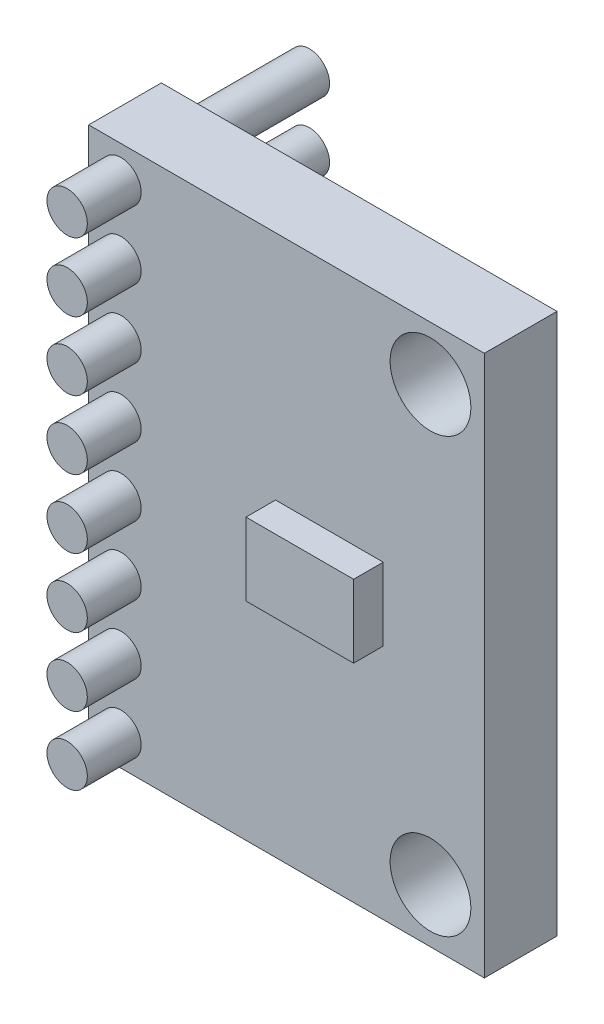
ISO-10303-21;
HEADER;
FILE_DESCRIPTION(('STEP AP214'),'2;1');
FILE_NAME('part.step','',(''),(''),'','','');
FILE_SCHEMA(('AUTOMOTIVE_DESIGN { 1 0 10303 214 1 1 1 1 }'));
ENDSEC;
DATA;
#1=APPLICATION_CONTEXT('core data for automotive mechanical design processes');
#2=APPLICATION_PROTOCOL_DEFINITION('international standard','automotive_design',2000,#1);
#3=PRODUCT_CONTEXT('',#1,'mechanical');
#4=PRODUCT('Part','Part','',(#3));
#5=PRODUCT_RELATED_PRODUCT_CATEGORY('part','',(#4));
#6=PRODUCT_DEFINITION_FORMATION('','',#4);
#7=PRODUCT_DEFINITION_CONTEXT('part definition',#1,'design');
#8=PRODUCT_DEFINITION('design','',#6,#7);
#9=PRODUCT_DEFINITION_SHAPE('','',#8);
#10=(LENGTH_UNIT() NAMED_UNIT(*) SI_UNIT(.MILLI.,.METRE.));
#11=(NAMED_UNIT(*) PLANE_ANGLE_UNIT() SI_UNIT($,.RADIAN.));
#12=(NAMED_UNIT(*) SI_UNIT($,.STERADIAN.) SOLID_ANGLE_UNIT());
#13=UNCERTAINTY_MEASURE_WITH_UNIT(LENGTH_MEASURE(1.E-05),#10,'distance_accuracy_value','');
#14=(GEOMETRIC_REPRESENTATION_CONTEXT(3) GLOBAL_UNCERTAINTY_ASSIGNED_CONTEXT((#13)) GLOBAL_UNIT_ASSIGNED_CONTEXT((#10,
#11,#12)) REPRESENTATION_CONTEXT('',''));
#15=CARTESIAN_POINT('',(0.,0.,0.));
#16=DIRECTION('',(0.,0.,1.));
#17=DIRECTION('',(1.,0.,0.));
#18=AXIS2_PLACEMENT_3D('',#15,#16,#17);
#19=CARTESIAN_POINT('',(-0.0249547085544615,-7.62988142191552,9.01269904910709));
#20=DIRECTION('',(-4.37113882867379E-08,0.,0.999999999999999));
#21=DIRECTION('',(0.999999999999999,0.,4.37113882867379E-08));
#22=AXIS2_PLACEMENT_3D('',#19,#20,#21);
#23=PLANE('',#22);
#24=CARTESIAN_POINT('',(-0.0249547085544615,-7.62988142191552,9.01269904910709));
#25=DIRECTION('',(-4.37113882867379E-08,0.,0.999999999999999));
#26=DIRECTION('',(0.999999999999999,0.,4.37113882867379E-08));
#27=AXIS2_PLACEMENT_3D('',#24,#25,#26);
#28=CIRCLE('',#27,0.750000000000001);
#29=CARTESIAN_POINT('',(0.725045291445539,-7.62988142191552,9.01269908189063));
#30=VERTEX_POINT('',#29);
#31=EDGE_CURVE('E280',#30,#30,#28,.F.);
#32=ORIENTED_EDGE('',*,*,#31,.F.);
#33=EDGE_LOOP('',(#32));
#34=FACE_BOUND('',#33,.T.);
#35=ADVANCED_FACE('F17',(#34),#23,.T.);
#36=CARTESIAN_POINT('',(-0.0249549003191127,-5.08988142191552,9.01269904910709));
#37=DIRECTION('',(-4.37113882867379E-08,0.,0.999999999999999));
#38=DIRECTION('',(0.999999999999999,0.,4.37113882867379E-08));
#39=AXIS2_PLACEMENT_3D('',#36,#37,#38);
#40=PLANE('',#39);
#41=CARTESIAN_POINT('',(-0.0249549003191128,-5.08988142191552,9.01269904910709));
#42=DIRECTION('',(-4.37113882867379E-08,0.,0.999999999999999));
#43=DIRECTION('',(0.999999999999999,0.,4.37113882867379E-08));
#44=AXIS2_PLACEMENT_3D('',#41,#42,#43);
#45=CIRCLE('',#44,0.750000000000001);
#46=CARTESIAN_POINT('',(0.725045099680888,-5.08988142191552,9.01269908189063));
#47=VERTEX_POINT('',#46);
#48=EDGE_CURVE('E275',#47,#47,#45,.F.);
#49=ORIENTED_EDGE('',*,*,#48,.F.);
#50=EDGE_LOOP('',(#49));
#51=FACE_BOUND('',#50,.T.);
#52=ADVANCED_FACE('F288',(#51),#40,.T.);
#53=CARTESIAN_POINT('',(-0.0249550920837631,-2.54988142191552,9.01269904910709));
#54=DIRECTION('',(-4.37113882867379E-08,0.,0.999999999999999));
#55=DIRECTION('',(0.999999999999999,0.,4.37113882867379E-08));
#56=AXIS2_PLACEMENT_3D('',#53,#54,#55);
#57=PLANE('',#56);
#58=CARTESIAN_POINT('',(-0.0249550920837631,-2.54988142191552,9.01269904910709));
#59=DIRECTION('',(-4.37113882867379E-08,0.,0.999999999999999));
#60=DIRECTION('',(0.999999999999999,0.,4.37113882867379E-08));
#61=AXIS2_PLACEMENT_3D('',#58,#59,#60);
#62=CIRCLE('',#61,0.750000000000001);
#63=CARTESIAN_POINT('',(0.725044907916237,-2.54988142191552,9.01269908189063));
#64=VERTEX_POINT('',#63);
#65=EDGE_CURVE('E270',#64,#64,#62,.F.);
#66=ORIENTED_EDGE('',*,*,#65,.F.);
#67=EDGE_LOOP('',(#66));
#68=FACE_BOUND('',#67,.T.);
#69=ADVANCED_FACE('F293',(#68),#57,.T.);
#70=CARTESIAN_POINT('',(-0.0249552838484144,-0.00988142191551966,9.01269904910709));
#71=DIRECTION('',(-4.37113882867379E-08,0.,0.999999999999999));
#72=DIRECTION('',(0.999999999999999,0.,4.37113882867379E-08));
#73=AXIS2_PLACEMENT_3D('',#70,#71,#72);
#74=PLANE('',#73);
#75=CARTESIAN_POINT('',(-0.0249552838484144,-0.00988142191551961,9.01269904910709));
#76=DIRECTION('',(-4.37113882867379E-08,0.,0.999999999999999));
#77=DIRECTION('',(0.999999999999999,0.,4.37113882867379E-08));
#78=AXIS2_PLACEMENT_3D('',#75,#76,#77);
#79=CIRCLE('',#78,0.75);
#80=CARTESIAN_POINT('',(0.725044716151585,-0.00988142191551961,9.01269908189063));
#81=VERTEX_POINT('',#80);
#82=EDGE_CURVE('E265',#81,#81,#79,.F.);
#83=ORIENTED_EDGE('',*,*,#82,.F.);
#84=EDGE_LOOP('',(#83));
#85=FACE_BOUND('',#84,.T.);
#86=ADVANCED_FACE('F455',(#85),#74,.T.);
#87=CARTESIAN_POINT('',(-0.0249554756130657,2.53011857808448,9.01269904910709));
#88=DIRECTION('',(-4.37113882867379E-08,0.,0.999999999999999));
#89=DIRECTION('',(0.999999999999999,0.,4.37113882867379E-08));
#90=AXIS2_PLACEMENT_3D('',#87,#88,#89);
#91=PLANE('',#90);
#92=CARTESIAN_POINT('',(-0.0249554756130657,2.53011857808448,9.01269904910709));
#93=DIRECTION('',(-4.37113882867379E-08,0.,0.999999999999999));
#94=DIRECTION('',(0.999999999999999,0.,4.37113882867379E-08));
#95=AXIS2_PLACEMENT_3D('',#92,#93,#94);
#96=CIRCLE('',#95,0.75);
#97=CARTESIAN_POINT('',(0.725044524386934,2.53011857808448,9.01269908189063));
#98=VERTEX_POINT('',#97);
#99=EDGE_CURVE('E260',#98,#98,#96,.F.);
#100=ORIENTED_EDGE('',*,*,#99,.F.);
#101=EDGE_LOOP('',(#100));
#102=FACE_BOUND('',#101,.T.);
#103=ADVANCED_FACE('F451',(#102),#91,.T.);
#104=CARTESIAN_POINT('',(-0.0249556673777169,5.07011857808448,9.01269904910709));
#105=DIRECTION('',(-4.37113882867379E-08,0.,0.999999999999999));
#106=DIRECTION('',(0.999999999999999,0.,4.37113882867379E-08));
#107=AXIS2_PLACEMENT_3D('',#104,#105,#106);
#108=PLANE('',#107);
#109=CARTESIAN_POINT('',(-0.0249556673777169,5.07011857808448,9.01269904910709));
#110=DIRECTION('',(-4.37113882867379E-08,0.,0.999999999999999));
#111=DIRECTION('',(0.999999999999999,0.,4.37113882867379E-08));
#112=AXIS2_PLACEMENT_3D('',#109,#110,#111);
#113=CIRCLE('',#112,0.75);
#114=CARTESIAN_POINT('',(0.725044332622282,5.07011857808448,9.01269908189063));
#115=VERTEX_POINT('',#114);
#116=EDGE_CURVE('E255',#115,#115,#113,.F.);
#117=ORIENTED_EDGE('',*,*,#116,.F.);
#118=EDGE_LOOP('',(#117));
#119=FACE_BOUND('',#118,.T.);
#120=ADVANCED_FACE('F447',(#119),#108,.T.);
#121=CARTESIAN_POINT('',(-0.0249558591423682,7.61011857808448,9.01269904910709));
#122=DIRECTION('',(-4.37113882867379E-08,0.,0.999999999999999));
#123=DIRECTION('',(0.999999999999999,0.,4.37113882867379E-08));
#124=AXIS2_PLACEMENT_3D('',#121,#122,#123);
#125=PLANE('',#124);
#126=CARTESIAN_POINT('',(-0.0249558591423682,7.61011857808448,9.01269904910709));
#127=DIRECTION('',(-4.37113882867379E-08,0.,0.999999999999999));
#128=DIRECTION('',(0.999999999999999,0.,4.37113882867379E-08));
#129=AXIS2_PLACEMENT_3D('',#126,#127,#128);
#130=CIRCLE('',#129,0.750000000000001);
#131=CARTESIAN_POINT('',(0.725044140857632,7.61011857808448,9.01269908189063));
#132=VERTEX_POINT('',#131);
#133=EDGE_CURVE('E250',#132,#132,#130,.F.);
#134=ORIENTED_EDGE('',*,*,#133,.F.);
#135=EDGE_LOOP('',(#134));
#136=FACE_BOUND('',#135,.T.);
#137=ADVANCED_FACE('F443',(#136),#125,.T.);
#138=CARTESIAN_POINT('',(-0.0249560509070195,10.1501185780845,9.01269904910709));
#139=DIRECTION('',(-4.37113882867379E-08,0.,0.999999999999999));
#140=DIRECTION('',(0.999999999999999,0.,4.37113882867379E-08));
#141=AXIS2_PLACEMENT_3D('',#138,#139,#140);
#142=PLANE('',#141);
#143=CARTESIAN_POINT('',(-0.0249560509070195,10.1501185780845,9.01269904910709));
#144=DIRECTION('',(-4.37113882867379E-08,0.,0.999999999999999));
#145=DIRECTION('',(0.999999999999999,0.,4.37113882867379E-08));
#146=AXIS2_PLACEMENT_3D('',#143,#144,#145);
#147=CIRCLE('',#146,0.750000000000001);
#148=CARTESIAN_POINT('',(0.725043949092981,10.1501185780845,9.01269908189063));
#149=VERTEX_POINT('',#148);
#150=EDGE_CURVE('E96',#149,#149,#147,.F.);
#151=ORIENTED_EDGE('',*,*,#150,.F.);
#152=EDGE_LOOP('',(#151));
#153=FACE_BOUND('',#152,.T.);
#154=ADVANCED_FACE('F440',(#153),#142,.T.);
#155=CARTESIAN_POINT('',(6.1250446565896,1.30011904239653,8.11269931793213));
#156=DIRECTION('',(4.37113882867379E-08,0.,-0.999999999999999));
#157=DIRECTION('',(-0.999999999999999,0.,-4.37113882867379E-08));
#158=AXIS2_PLACEMENT_3D('',#155,#156,#157);
#159=PLANE('',#158);
#160=DIRECTION('',(-7.54978942991605E-08,0.999999999999997,0.));
#161=VECTOR('',#160,1.);
#162=CARTESIAN_POINT('',(5.71828192010385,0.0509064415354505,8.11269930015196));
#163=LINE('',#162,#161);
#164=CARTESIAN_POINT('',(5.71828181818169,2.75090644153545,8.11269934386335));
#165=VERTEX_POINT('',#164);
#166=CARTESIAN_POINT('',(5.71828193212448,0.0509065170333455,8.11269930015196));
#167=VERTEX_POINT('',#166);
#168=EDGE_CURVE('E87',#165,#167,#163,.F.);
#169=ORIENTED_EDGE('',*,*,#168,.T.);
#170=DIRECTION('',(-0.999999999999997,-7.5497894267036E-08,0.));
#171=VECTOR('',#170,1.);
#172=CARTESIAN_POINT('',(9.71828192010385,0.0509067435270276,8.11269930015196));
#173=LINE('',#172,#171);
#174=CARTESIAN_POINT('',(9.71828181818169,0.0509067435270275,8.11269943128612));
#175=VERTEX_POINT('',#174);
#176=EDGE_CURVE('E838',#167,#175,#173,.F.);
#177=ORIENTED_EDGE('',*,*,#176,.T.);
#178=DIRECTION('',(7.54978941586158E-08,-0.999999999999997,0.));
#179=VECTOR('',#178,1.);
#180=CARTESIAN_POINT('',(9.71828192010385,0.0509067435270276,8.11269947499751));
#181=LINE('',#180,#179);
#182=CARTESIAN_POINT('',(9.71828172828016,2.75090659253124,8.11269947499751));
#183=VERTEX_POINT('',#182);
#184=EDGE_CURVE('E100',#175,#183,#181,.F.);
#185=ORIENTED_EDGE('',*,*,#184,.T.);
#186=DIRECTION('',(0.999999999999997,7.54978941044057E-08,0.));
#187=VECTOR('',#186,1.);
#188=CARTESIAN_POINT('',(9.71828171625953,2.75090674352703,8.11269947499751));
#189=LINE('',#188,#187);
#190=EDGE_CURVE('E81',#183,#165,#189,.F.);
#191=ORIENTED_EDGE('',*,*,#190,.T.);
#192=EDGE_LOOP('',(#169,#177,#185,#191));
#193=FACE_BOUND('',#192,.T.);
#194=ADVANCED_FACE('F103',(#193),#159,.F.);
#195=CARTESIAN_POINT('',(-0.0249543151519669,-7.62988142191549,0.0126990491070913));
#196=DIRECTION('',(-4.37113882867379E-08,0.,0.999999999999999));
#197=DIRECTION('',(0.999999999999999,0.,4.37113882867379E-08));
#198=AXIS2_PLACEMENT_3D('',#195,#196,#197);
#199=CYLINDRICAL_SURFACE('',#198,0.750000000000001);
#200=CARTESIAN_POINT('',(-0.0249546211316849,-7.62988142191551,7.01269904910709));
#201=DIRECTION('',(-4.37113882867379E-08,0.,0.999999999999999));
#202=DIRECTION('',(0.999999999999999,0.,4.37113882867379E-08));
#203=AXIS2_PLACEMENT_3D('',#200,#201,#202);
#204=CIRCLE('',#203,0.750000000000001);
#205=CARTESIAN_POINT('',(0.725045378868315,-7.62988142191551,7.01269908189064));
#206=VERTEX_POINT('',#205);
#207=EDGE_CURVE('E240',#206,#206,#204,.F.);
#208=ORIENTED_EDGE('',*,*,#207,.F.);
#209=EDGE_LOOP('',(#208));
#210=FACE_BOUND('',#209,.T.);
#211=ORIENTED_EDGE('',*,*,#31,.T.);
#212=EDGE_LOOP('',(#211));
#213=FACE_BOUND('',#212,.T.);
#214=ADVANCED_FACE('F285',(#210,#213),#199,.T.);
#215=CARTESIAN_POINT('',(-0.0249545069166182,-5.08988142191549,0.0126990491070913));
#216=DIRECTION('',(-4.37113882867379E-08,0.,0.999999999999999));
#217=DIRECTION('',(0.999999999999999,0.,4.37113882867379E-08));
#218=AXIS2_PLACEMENT_3D('',#215,#216,#217);
#219=CYLINDRICAL_SURFACE('',#218,0.750000000000001);
#220=CARTESIAN_POINT('',(-0.0249548128963362,-5.08988142191551,7.01269904910709));
#221=DIRECTION('',(-4.37113882867379E-08,0.,0.999999999999999));
#222=DIRECTION('',(0.999999999999999,0.,4.37113882867379E-08));
#223=AXIS2_PLACEMENT_3D('',#220,#221,#222);
#224=CIRCLE('',#223,0.750000000000001);
#225=CARTESIAN_POINT('',(0.725045187103664,-5.08988142191551,7.01269908189064));
#226=VERTEX_POINT('',#225);
#227=EDGE_CURVE('E235',#226,#226,#224,.F.);
#228=ORIENTED_EDGE('',*,*,#227,.F.);
#229=EDGE_LOOP('',(#228));
#230=FACE_BOUND('',#229,.T.);
#231=ORIENTED_EDGE('',*,*,#48,.T.);
#232=EDGE_LOOP('',(#231));
#233=FACE_BOUND('',#232,.T.);
#234=ADVANCED_FACE('F430',(#230,#233),#219,.T.);
#235=CARTESIAN_POINT('',(-0.0249546986812685,-2.54988142191549,0.0126990491070913));
#236=DIRECTION('',(-4.37113882867379E-08,0.,0.999999999999999));
#237=DIRECTION('',(0.999999999999999,0.,4.37113882867379E-08));
#238=AXIS2_PLACEMENT_3D('',#235,#236,#237);
#239=CYLINDRICAL_SURFACE('',#238,0.750000000000001);
#240=CARTESIAN_POINT('',(-0.0249550046609865,-2.54988142191551,7.01269904910709));
#241=DIRECTION('',(-4.37113882867379E-08,0.,0.999999999999999));
#242=DIRECTION('',(0.999999999999999,0.,4.37113882867379E-08));
#243=AXIS2_PLACEMENT_3D('',#240,#241,#242);
#244=CIRCLE('',#243,0.750000000000001);
#245=CARTESIAN_POINT('',(0.725044995339014,-2.54988142191551,7.01269908189064));
#246=VERTEX_POINT('',#245);
#247=EDGE_CURVE('E230',#246,#246,#244,.F.);
#248=ORIENTED_EDGE('',*,*,#247,.F.);
#249=EDGE_LOOP('',(#248));
#250=FACE_BOUND('',#249,.T.);
#251=ORIENTED_EDGE('',*,*,#65,.T.);
#252=EDGE_LOOP('',(#251));
#253=FACE_BOUND('',#252,.T.);
#254=ADVANCED_FACE('F426',(#250,#253),#239,.T.);
#255=CARTESIAN_POINT('',(-0.0249548904459198,-0.00988142191548991,0.0126990491070913));
#256=DIRECTION('',(-4.37113882867379E-08,0.,0.999999999999999));
#257=DIRECTION('',(0.999999999999999,0.,4.37113882867379E-08));
#258=AXIS2_PLACEMENT_3D('',#255,#256,#257);
#259=CYLINDRICAL_SURFACE('',#258,0.75);
#260=CARTESIAN_POINT('',(-0.0249551964256378,-0.00988142191551301,7.01269904910709));
#261=DIRECTION('',(-4.37113882867379E-08,0.,0.999999999999999));
#262=DIRECTION('',(0.999999999999999,0.,4.37113882867379E-08));
#263=AXIS2_PLACEMENT_3D('',#260,#261,#262);
#264=CIRCLE('',#263,0.75);
#265=CARTESIAN_POINT('',(0.725044803574361,-0.00988142191551301,7.01269908189064));
#266=VERTEX_POINT('',#265);
#267=EDGE_CURVE('E225',#266,#266,#264,.F.);
#268=ORIENTED_EDGE('',*,*,#267,.F.);
#269=EDGE_LOOP('',(#268));
#270=FACE_BOUND('',#269,.T.);
#271=ORIENTED_EDGE('',*,*,#82,.T.);
#272=EDGE_LOOP('',(#271));
#273=FACE_BOUND('',#272,.T.);
#274=ADVANCED_FACE('F422',(#270,#273),#259,.T.);
#275=CARTESIAN_POINT('',(-0.0249550822105711,2.53011857808451,0.0126990491070913));
#276=DIRECTION('',(-4.37113882867379E-08,0.,0.999999999999999));
#277=DIRECTION('',(0.999999999999999,0.,4.37113882867379E-08));
#278=AXIS2_PLACEMENT_3D('',#275,#276,#277);
#279=CYLINDRICAL_SURFACE('',#278,0.75);
#280=CARTESIAN_POINT('',(-0.0249553881902891,2.53011857808449,7.01269904910709));
#281=DIRECTION('',(-4.37113882867379E-08,0.,0.999999999999999));
#282=DIRECTION('',(0.999999999999999,0.,4.37113882867379E-08));
#283=AXIS2_PLACEMENT_3D('',#280,#281,#282);
#284=CIRCLE('',#283,0.75);
#285=CARTESIAN_POINT('',(0.72504461180971,2.53011857808449,7.01269908189064));
#286=VERTEX_POINT('',#285);
#287=EDGE_CURVE('E220',#286,#286,#284,.F.);
#288=ORIENTED_EDGE('',*,*,#287,.F.);
#289=EDGE_LOOP('',(#288));
#290=FACE_BOUND('',#289,.T.);
#291=ORIENTED_EDGE('',*,*,#99,.T.);
#292=EDGE_LOOP('',(#291));
#293=FACE_BOUND('',#292,.T.);
#294=ADVANCED_FACE('F418',(#290,#293),#279,.T.);
#295=CARTESIAN_POINT('',(-0.0249552739752223,5.07011857808451,0.0126990491070913));
#296=DIRECTION('',(-4.37113882867379E-08,0.,0.999999999999999));
#297=DIRECTION('',(0.999999999999999,0.,4.37113882867379E-08));
#298=AXIS2_PLACEMENT_3D('',#295,#296,#297);
#299=CYLINDRICAL_SURFACE('',#298,0.75);
#300=CARTESIAN_POINT('',(-0.0249555799549403,5.07011857808449,7.01269904910709));
#301=DIRECTION('',(-4.37113882867379E-08,0.,0.999999999999999));
#302=DIRECTION('',(0.999999999999999,0.,4.37113882867379E-08));
#303=AXIS2_PLACEMENT_3D('',#300,#301,#302);
#304=CIRCLE('',#303,0.75);
#305=CARTESIAN_POINT('',(0.725044420045059,5.07011857808449,7.01269908189064));
#306=VERTEX_POINT('',#305);
#307=EDGE_CURVE('E215',#306,#306,#304,.F.);
#308=ORIENTED_EDGE('',*,*,#307,.F.);
#309=EDGE_LOOP('',(#308));
#310=FACE_BOUND('',#309,.T.);
#311=ORIENTED_EDGE('',*,*,#116,.T.);
#312=EDGE_LOOP('',(#311));
#313=FACE_BOUND('',#312,.T.);
#314=ADVANCED_FACE('F414',(#310,#313),#299,.T.);
#315=CARTESIAN_POINT('',(-0.0249554657398736,7.61011857808451,0.0126990491070913));
#316=DIRECTION('',(-4.37113882867379E-08,0.,0.999999999999999));
#317=DIRECTION('',(0.999999999999999,0.,4.37113882867379E-08));
#318=AXIS2_PLACEMENT_3D('',#315,#316,#317);
#319=CYLINDRICAL_SURFACE('',#318,0.750000000000001);
#320=CARTESIAN_POINT('',(-0.0249557717195916,7.61011857808449,7.01269904910709));
#321=DIRECTION('',(-4.37113882867379E-08,0.,0.999999999999999));
#322=DIRECTION('',(0.999999999999999,0.,4.37113882867379E-08));
#323=AXIS2_PLACEMENT_3D('',#320,#321,#322);
#324=CIRCLE('',#323,0.750000000000001);
#325=CARTESIAN_POINT('',(0.725044228280409,7.61011857808449,7.01269908189064));
#326=VERTEX_POINT('',#325);
#327=EDGE_CURVE('E210',#326,#326,#324,.F.);
#328=ORIENTED_EDGE('',*,*,#327,.F.);
#329=EDGE_LOOP('',(#328));
#330=FACE_BOUND('',#329,.T.);
#331=ORIENTED_EDGE('',*,*,#133,.T.);
#332=EDGE_LOOP('',(#331));
#333=FACE_BOUND('',#332,.T.);
#334=ADVANCED_FACE('F410',(#330,#333),#319,.T.);
#335=CARTESIAN_POINT('',(-0.0249556575045249,10.1501185780845,0.0126990491070913));
#336=DIRECTION('',(-4.37113882867379E-08,0.,0.999999999999999));
#337=DIRECTION('',(0.999999999999999,0.,4.37113882867379E-08));
#338=AXIS2_PLACEMENT_3D('',#335,#336,#337);
#339=CYLINDRICAL_SURFACE('',#338,0.750000000000001);
#340=CARTESIAN_POINT('',(-0.0249559634842429,10.1501185780845,7.01269904910709));
#341=DIRECTION('',(-4.37113882867379E-08,0.,0.999999999999999));
#342=DIRECTION('',(0.999999999999999,0.,4.37113882867379E-08));
#343=AXIS2_PLACEMENT_3D('',#340,#341,#342);
#344=CIRCLE('',#343,0.750000000000001);
#345=CARTESIAN_POINT('',(0.725044036515757,10.1501185780845,7.01269908189064));
#346=VERTEX_POINT('',#345);
#347=EDGE_CURVE('E206',#346,#346,#344,.F.);
#348=ORIENTED_EDGE('',*,*,#347,.F.);
#349=EDGE_LOOP('',(#348));
#350=FACE_BOUND('',#349,.T.);
#351=ORIENTED_EDGE('',*,*,#150,.T.);
#352=EDGE_LOOP('',(#351));
#353=FACE_BOUND('',#352,.T.);
#354=ADVANCED_FACE('F407',(#350,#353),#339,.T.);
#355=CARTESIAN_POINT('',(5.71828192010385,0.0509064415354505,8.11269930015196));
#356=DIRECTION('',(0.999999999999996,7.54978942991604E-08,4.37113882867378E-08));
#357=DIRECTION('',(-7.54978942991605E-08,0.999999999999997,0.));
#358=AXIS2_PLACEMENT_3D('',#355,#356,#357);
#359=PLANE('',#358);
#360=DIRECTION('',(0.,0.,1.));
#361=VECTOR('',#360,1.);
#362=CARTESIAN_POINT('',(5.71828196818637,0.0509064415354542,8.11269947499751));
#363=LINE('',#362,#361);
#364=CARTESIAN_POINT('',(5.71828196818637,0.0509065170333484,7.01269934386335));
#365=VERTEX_POINT('',#364);
#366=EDGE_CURVE('E92',#365,#167,#363,.T.);
#367=ORIENTED_EDGE('',*,*,#366,.T.);
#368=ORIENTED_EDGE('',*,*,#168,.F.);
#369=DIRECTION('',(0.,0.,1.));
#370=VECTOR('',#369,1.);
#371=CARTESIAN_POINT('',(5.71828171625953,2.75090644153545,8.11269947499751));
#372=LINE('',#371,#370);
#373=CARTESIAN_POINT('',(5.71828180328251,2.75090644153545,7.01269930015196));
#374=VERTEX_POINT('',#373);
#375=EDGE_CURVE('E90',#165,#374,#372,.F.);
#376=ORIENTED_EDGE('',*,*,#375,.T.);
#377=DIRECTION('',(0.,1.,0.));
#378=VECTOR('',#377,1.);
#379=CARTESIAN_POINT('',(5.71828196818637,1.30011904239654,7.01269930015197));
#380=LINE('',#379,#378);
#381=EDGE_CURVE('E209',#365,#374,#380,.T.);
#382=ORIENTED_EDGE('',*,*,#381,.F.);
#383=EDGE_LOOP('',(#367,#368,#376,#382));
#384=FACE_BOUND('',#383,.T.);
#385=ADVANCED_FACE('F88',(#384),#359,.F.);
#386=CARTESIAN_POINT('',(9.71828171625953,2.75090674352703,8.11269947499751));
#387=DIRECTION('',(7.54978941044057E-08,-0.999999999999997,0.));
#388=DIRECTION('',(0.999999999999997,7.54978941044057E-08,0.));
#389=AXIS2_PLACEMENT_3D('',#386,#387,#388);
#390=PLANE('',#389);
#391=ORIENTED_EDGE('',*,*,#375,.F.);
#392=ORIENTED_EDGE('',*,*,#190,.F.);
#393=DIRECTION('',(-4.37113882867376E-08,0.,0.999999999999999));
#394=VECTOR('',#393,1.);
#395=CARTESIAN_POINT('',(9.71828171625954,2.75090674352703,8.11269947499751));
#396=LINE('',#395,#394);
#397=CARTESIAN_POINT('',(9.71828176434206,2.75090666802914,7.01269938757474));
#398=VERTEX_POINT('',#397);
#399=EDGE_CURVE('E841',#183,#398,#396,.F.);
#400=ORIENTED_EDGE('',*,*,#399,.T.);
#401=DIRECTION('',(0.999999999999999,0.,4.37113882867379E-08));
#402=VECTOR('',#401,1.);
#403=CARTESIAN_POINT('',(6.12504470467212,2.75090644153545,7.01269931793214));
#404=LINE('',#403,#402);
#405=EDGE_CURVE('E99',#374,#398,#404,.T.);
#406=ORIENTED_EDGE('',*,*,#405,.F.);
#407=EDGE_LOOP('',(#391,#392,#400,#406));
#408=FACE_BOUND('',#407,.T.);
#409=ADVANCED_FACE('F98',(#408),#390,.F.);
#410=CARTESIAN_POINT('',(9.71828192010385,0.0509067435270276,8.11269947499751));
#411=DIRECTION('',(-0.999999999999996,-7.54978941586157E-08,-4.37113882867378E-08));
#412=DIRECTION('',(7.54978941586158E-08,-0.999999999999997,0.));
#413=AXIS2_PLACEMENT_3D('',#410,#411,#412);
#414=PLANE('',#413);
#415=ORIENTED_EDGE('',*,*,#399,.F.);
#416=ORIENTED_EDGE('',*,*,#184,.F.);
#417=DIRECTION('',(0.,0.,1.));
#418=VECTOR('',#417,1.);
#419=CARTESIAN_POINT('',(9.71828192010385,0.0509067435270276,8.11269947499751));
#420=LINE('',#419,#418);
#421=CARTESIAN_POINT('',(9.71828190520467,0.0509067435270303,7.01269947499751));
#422=VERTEX_POINT('',#421);
#423=EDGE_CURVE('E245',#175,#422,#420,.F.);
#424=ORIENTED_EDGE('',*,*,#423,.T.);
#425=DIRECTION('',(0.,1.,0.));
#426=VECTOR('',#425,1.);
#427=CARTESIAN_POINT('',(9.71828176434206,1.30011904239654,7.01269947499751));
#428=LINE('',#427,#426);
#429=EDGE_CURVE('E832',#398,#422,#428,.F.);
#430=ORIENTED_EDGE('',*,*,#429,.F.);
#431=EDGE_LOOP('',(#415,#416,#424,#430));
#432=FACE_BOUND('',#431,.T.);
#433=ADVANCED_FACE('F398',(#432),#414,.F.);
#434=CARTESIAN_POINT('',(9.71828192010385,0.0509067435270276,8.11269947499751));
#435=DIRECTION('',(-7.5497894267036E-08,0.999999999999997,0.));
#436=DIRECTION('',(-0.999999999999997,-7.5497894267036E-08,0.));
#437=AXIS2_PLACEMENT_3D('',#434,#435,#436);
#438=PLANE('',#437);
#439=ORIENTED_EDGE('',*,*,#423,.F.);
#440=ORIENTED_EDGE('',*,*,#176,.F.);
#441=ORIENTED_EDGE('',*,*,#366,.F.);
#442=DIRECTION('',(0.999999999999999,0.,4.37113882867379E-08));
#443=VECTOR('',#442,1.);
#444=CARTESIAN_POINT('',(6.12504470467212,0.0509067435270308,7.01269931793213));
#445=LINE('',#444,#443);
#446=EDGE_CURVE('E829',#422,#365,#445,.F.);
#447=ORIENTED_EDGE('',*,*,#446,.F.);
#448=EDGE_LOOP('',(#439,#440,#441,#447));
#449=FACE_BOUND('',#448,.T.);
#450=ADVANCED_FACE('F394',(#449),#438,.F.);
#451=CARTESIAN_POINT('',(6.12504470467212,1.30011904239654,7.01269931793213));
#452=DIRECTION('',(-4.37113882867379E-08,0.,0.999999999999999));
#453=DIRECTION('',(0.999999999999999,0.,4.37113882867379E-08));
#454=AXIS2_PLACEMENT_3D('',#451,#452,#453);
#455=PLANE('',#454);
#456=ORIENTED_EDGE('',*,*,#429,.T.);
#457=ORIENTED_EDGE('',*,*,#446,.T.);
#458=ORIENTED_EDGE('',*,*,#381,.T.);
#459=ORIENTED_EDGE('',*,*,#405,.T.);
#460=EDGE_LOOP('',(#456,#457,#458,#459));
#461=FACE_BOUND('',#460,.T.);
#462=ORIENTED_EDGE('',*,*,#347,.T.);
#463=EDGE_LOOP('',(#462));
#464=FACE_BOUND('',#463,.T.);
#465=ORIENTED_EDGE('',*,*,#327,.T.);
#466=EDGE_LOOP('',(#465));
#467=FACE_BOUND('',#466,.T.);
#468=ORIENTED_EDGE('',*,*,#307,.T.);
#469=EDGE_LOOP('',(#468));
#470=FACE_BOUND('',#469,.T.);
#471=ORIENTED_EDGE('',*,*,#287,.T.);
#472=EDGE_LOOP('',(#471));
#473=FACE_BOUND('',#472,.T.);
#474=ORIENTED_EDGE('',*,*,#267,.T.);
#475=EDGE_LOOP('',(#474));
#476=FACE_BOUND('',#475,.T.);
#477=ORIENTED_EDGE('',*,*,#247,.T.);
#478=EDGE_LOOP('',(#477));
#479=FACE_BOUND('',#478,.T.);
#480=ORIENTED_EDGE('',*,*,#227,.T.);
#481=EDGE_LOOP('',(#480));
#482=FACE_BOUND('',#481,.T.);
#483=ORIENTED_EDGE('',*,*,#207,.T.);
#484=EDGE_LOOP('',(#483));
#485=FACE_BOUND('',#484,.T.);
#486=CARTESIAN_POINT('',(11.4750453124302,-6.74988055368973,7.01269955178805));
#487=DIRECTION('',(-4.37113882867379E-08,0.,0.999999999999999));
#488=DIRECTION('',(0.999999999999999,0.,4.37113882867379E-08));
#489=AXIS2_PLACEMENT_3D('',#486,#487,#488);
#490=CIRCLE('',#489,1.5);
#491=CARTESIAN_POINT('',(12.9750453124302,-6.74988055368973,7.01269961735514));
#492=VERTEX_POINT('',#491);
#493=EDGE_CURVE('E193',#492,#492,#490,.F.);
#494=ORIENTED_EDGE('',*,*,#493,.T.);
#495=EDGE_LOOP('',(#494));
#496=FACE_BOUND('',#495,.T.);
#497=CARTESIAN_POINT('',(11.4750440969141,9.35011944631027,7.01269955178805));
#498=DIRECTION('',(-4.37113882867379E-08,0.,0.999999999999999));
#499=DIRECTION('',(0.999999999999999,0.,4.37113882867379E-08));
#500=AXIS2_PLACEMENT_3D('',#497,#498,#499);
#501=CIRCLE('',#500,1.5);
#502=CARTESIAN_POINT('',(12.9750440969141,9.35011944631027,7.01269961735514));
#503=VERTEX_POINT('',#502);
#504=EDGE_CURVE('E198',#503,#503,#501,.F.);
#505=ORIENTED_EDGE('',*,*,#504,.T.);
#506=EDGE_LOOP('',(#505));
#507=FACE_BOUND('',#506,.T.);
#508=DIRECTION('',(-0.999999999999997,-7.54978941586158E-08,0.));
#509=VECTOR('',#508,1.);
#510=CARTESIAN_POINT('',(-1.22495453657404,-8.74988151251299,7.01269899665342));
#511=LINE('',#510,#509);
#512=CARTESIAN_POINT('',(-1.22495488644577,-8.74988151251299,7.01269899665341));
#513=VERTEX_POINT('',#512);
#514=CARTESIAN_POINT('',(13.475045463426,-8.74988068014871,7.01269931793213));
#515=VERTEX_POINT('',#514);
#516=EDGE_CURVE('E808',#513,#515,#511,.F.);
#517=ORIENTED_EDGE('',*,*,#516,.T.);
#518=DIRECTION('',(7.54978942880727E-08,-0.999999999999997,0.));
#519=VECTOR('',#518,1.);
#520=CARTESIAN_POINT('',(13.475045463426,-8.74988040269394,7.01269963921083));
#521=LINE('',#520,#519);
#522=CARTESIAN_POINT('',(13.4750443548004,11.3501195973061,7.01269963921085));
#523=VERTEX_POINT('',#522);
#524=EDGE_CURVE('E811',#515,#523,#521,.F.);
#525=ORIENTED_EDGE('',*,*,#524,.T.);
#526=DIRECTION('',(0.999999999999997,7.54978941586158E-08,0.));
#527=VECTOR('',#526,1.);
#528=CARTESIAN_POINT('',(-1.22495605408171,11.350118487487,7.01269963921083));
#529=LINE('',#528,#527);
#530=CARTESIAN_POINT('',(-1.22495605408171,11.3501190423966,7.01269915729277));
#531=VERTEX_POINT('',#530);
#532=EDGE_CURVE('E872',#523,#531,#529,.F.);
#533=ORIENTED_EDGE('',*,*,#532,.T.);
#534=DIRECTION('',(-7.54978942449204E-08,0.999999999999997,0.));
#535=VECTOR('',#534,1.);
#536=CARTESIAN_POINT('',(-1.22495453657404,-8.74988151251299,7.01269899665342));
#537=LINE('',#536,#535);
#538=EDGE_CURVE('E812',#531,#513,#537,.F.);
#539=ORIENTED_EDGE('',*,*,#538,.T.);
#540=EDGE_LOOP('',(#517,#525,#533,#539));
#541=FACE_BOUND('',#540,.T.);
#542=ADVANCED_FACE('F390',(#461,#464,#467,#470,#473,#476,#479,#482,#485,#496,#507,#541),#455,.T.);
#543=CARTESIAN_POINT('',(-0.0249543151519669,-7.62988142191549,0.0126990491070913));
#544=DIRECTION('',(-4.37113882867379E-08,0.,0.999999999999999));
#545=DIRECTION('',(0.999999999999999,0.,4.37113882867379E-08));
#546=AXIS2_PLACEMENT_3D('',#543,#544,#545);
#547=PLANE('',#546);
#548=CARTESIAN_POINT('',(-0.0249543151519669,-7.62988142191549,0.0126990491070922));
#549=DIRECTION('',(-4.37113882867379E-08,0.,0.999999999999999));
#550=DIRECTION('',(0.999999999999999,0.,4.37113882867379E-08));
#551=AXIS2_PLACEMENT_3D('',#548,#549,#550);
#552=CIRCLE('',#551,0.750000000000001);
#553=CARTESIAN_POINT('',(0.725045684848033,-7.62988142191549,0.0126990818906334));
#554=VERTEX_POINT('',#553);
#555=EDGE_CURVE('E188',#554,#554,#552,.T.);
#556=ORIENTED_EDGE('',*,*,#555,.F.);
#557=EDGE_LOOP('',(#556));
#558=FACE_BOUND('',#557,.T.);
#559=ADVANCED_FACE('F386',(#558),#547,.F.);
#560=CARTESIAN_POINT('',(-0.0249545069166182,-5.08988142191549,0.0126990491070913));
#561=DIRECTION('',(-4.37113882867379E-08,0.,0.999999999999999));
#562=DIRECTION('',(0.999999999999999,0.,4.37113882867379E-08));
#563=AXIS2_PLACEMENT_3D('',#560,#561,#562);
#564=PLANE('',#563);
#565=CARTESIAN_POINT('',(-0.0249545069166182,-5.08988142191549,0.0126990491070922));
#566=DIRECTION('',(-4.37113882867379E-08,0.,0.999999999999999));
#567=DIRECTION('',(0.999999999999999,0.,4.37113882867379E-08));
#568=AXIS2_PLACEMENT_3D('',#565,#566,#567);
#569=CIRCLE('',#568,0.750000000000001);
#570=CARTESIAN_POINT('',(0.725045493083382,-5.08988142191549,0.0126990818906334));
#571=VERTEX_POINT('',#570);
#572=EDGE_CURVE('E183',#571,#571,#569,.T.);
#573=ORIENTED_EDGE('',*,*,#572,.F.);
#574=EDGE_LOOP('',(#573));
#575=FACE_BOUND('',#574,.T.);
#576=ADVANCED_FACE('F382',(#575),#564,.F.);
#577=CARTESIAN_POINT('',(-0.0249546986812685,-2.54988142191549,0.0126990491070913));
#578=DIRECTION('',(-4.37113882867379E-08,0.,0.999999999999999));
#579=DIRECTION('',(0.999999999999999,0.,4.37113882867379E-08));
#580=AXIS2_PLACEMENT_3D('',#577,#578,#579);
#581=PLANE('',#580);
#582=CARTESIAN_POINT('',(-0.0249546986812685,-2.54988142191549,0.0126990491070922));
#583=DIRECTION('',(-4.37113882867379E-08,0.,0.999999999999999));
#584=DIRECTION('',(0.999999999999999,0.,4.37113882867379E-08));
#585=AXIS2_PLACEMENT_3D('',#582,#583,#584);
#586=CIRCLE('',#585,0.750000000000001);
#587=CARTESIAN_POINT('',(0.725045301318732,-2.54988142191549,0.0126990818906334));
#588=VERTEX_POINT('',#587);
#589=EDGE_CURVE('E178',#588,#588,#586,.T.);
#590=ORIENTED_EDGE('',*,*,#589,.F.);
#591=EDGE_LOOP('',(#590));
#592=FACE_BOUND('',#591,.T.);
#593=ADVANCED_FACE('F378',(#592),#581,.F.);
#594=CARTESIAN_POINT('',(-0.0249548904459198,-0.00988142191548991,0.0126990491070913));
#595=DIRECTION('',(-4.37113882867379E-08,0.,0.999999999999999));
#596=DIRECTION('',(0.999999999999999,0.,4.37113882867379E-08));
#597=AXIS2_PLACEMENT_3D('',#594,#595,#596);
#598=PLANE('',#597);
#599=CARTESIAN_POINT('',(-0.0249548904459198,-0.00988142191548991,0.0126990491070922));
#600=DIRECTION('',(-4.37113882867379E-08,0.,0.999999999999999));
#601=DIRECTION('',(0.999999999999999,0.,4.37113882867379E-08));
#602=AXIS2_PLACEMENT_3D('',#599,#600,#601);
#603=CIRCLE('',#602,0.75);
#604=CARTESIAN_POINT('',(0.725045109554079,-0.00988142191548991,0.0126990818906334));
#605=VERTEX_POINT('',#604);
#606=EDGE_CURVE('E173',#605,#605,#603,.T.);
#607=ORIENTED_EDGE('',*,*,#606,.F.);
#608=EDGE_LOOP('',(#607));
#609=FACE_BOUND('',#608,.T.);
#610=ADVANCED_FACE('F374',(#609),#598,.F.);
#611=CARTESIAN_POINT('',(-0.0249550822105711,2.53011857808451,0.0126990491070913));
#612=DIRECTION('',(-4.37113882867379E-08,0.,0.999999999999999));
#613=DIRECTION('',(0.999999999999999,0.,4.37113882867379E-08));
#614=AXIS2_PLACEMENT_3D('',#611,#612,#613);
#615=PLANE('',#614);
#616=CARTESIAN_POINT('',(-0.0249550822105711,2.53011857808451,0.0126990491070922));
#617=DIRECTION('',(-4.37113882867379E-08,0.,0.999999999999999));
#618=DIRECTION('',(0.999999999999999,0.,4.37113882867379E-08));
#619=AXIS2_PLACEMENT_3D('',#616,#617,#618);
#620=CIRCLE('',#619,0.75);
#621=CARTESIAN_POINT('',(0.725044917789428,2.53011857808451,0.0126990818906334));
#622=VERTEX_POINT('',#621);
#623=EDGE_CURVE('E168',#622,#622,#620,.T.);
#624=ORIENTED_EDGE('',*,*,#623,.F.);
#625=EDGE_LOOP('',(#624));
#626=FACE_BOUND('',#625,.T.);
#627=ADVANCED_FACE('F370',(#626),#615,.F.);
#628=CARTESIAN_POINT('',(-0.0249552739752223,5.07011857808451,0.0126990491070913));
#629=DIRECTION('',(-4.37113882867379E-08,0.,0.999999999999999));
#630=DIRECTION('',(0.999999999999999,0.,4.37113882867379E-08));
#631=AXIS2_PLACEMENT_3D('',#628,#629,#630);
#632=PLANE('',#631);
#633=CARTESIAN_POINT('',(-0.0249552739752223,5.07011857808451,0.0126990491070922));
#634=DIRECTION('',(-4.37113882867379E-08,0.,0.999999999999999));
#635=DIRECTION('',(0.999999999999999,0.,4.37113882867379E-08));
#636=AXIS2_PLACEMENT_3D('',#633,#634,#635);
#637=CIRCLE('',#636,0.75);
#638=CARTESIAN_POINT('',(0.725044726024777,5.07011857808451,0.0126990818906334));
#639=VERTEX_POINT('',#638);
#640=EDGE_CURVE('E163',#639,#639,#637,.T.);
#641=ORIENTED_EDGE('',*,*,#640,.F.);
#642=EDGE_LOOP('',(#641));
#643=FACE_BOUND('',#642,.T.);
#644=ADVANCED_FACE('F366',(#643),#632,.F.);
#645=CARTESIAN_POINT('',(-0.0249554657398736,7.61011857808451,0.0126990491070913));
#646=DIRECTION('',(-4.37113882867379E-08,0.,0.999999999999999));
#647=DIRECTION('',(0.999999999999999,0.,4.37113882867379E-08));
#648=AXIS2_PLACEMENT_3D('',#645,#646,#647);
#649=PLANE('',#648);
#650=CARTESIAN_POINT('',(-0.0249554657398736,7.61011857808451,0.0126990491070922));
#651=DIRECTION('',(-4.37113882867379E-08,0.,0.999999999999999));
#652=DIRECTION('',(0.999999999999999,0.,4.37113882867379E-08));
#653=AXIS2_PLACEMENT_3D('',#650,#651,#652);
#654=CIRCLE('',#653,0.750000000000001);
#655=CARTESIAN_POINT('',(0.725044534260127,7.61011857808451,0.0126990818906334));
#656=VERTEX_POINT('',#655);
#657=EDGE_CURVE('E158',#656,#656,#654,.T.);
#658=ORIENTED_EDGE('',*,*,#657,.F.);
#659=EDGE_LOOP('',(#658));
#660=FACE_BOUND('',#659,.T.);
#661=ADVANCED_FACE('F362',(#660),#649,.F.);
#662=CARTESIAN_POINT('',(-0.0249556575045249,10.1501185780845,0.0126990491070913));
#663=DIRECTION('',(-4.37113882867379E-08,0.,0.999999999999999));
#664=DIRECTION('',(0.999999999999999,0.,4.37113882867379E-08));
#665=AXIS2_PLACEMENT_3D('',#662,#663,#664);
#666=PLANE('',#665);
#667=CARTESIAN_POINT('',(-0.0249556575045249,10.1501185780845,0.0126990491070922));
#668=DIRECTION('',(-4.37113882867379E-08,0.,0.999999999999999));
#669=DIRECTION('',(0.999999999999999,0.,4.37113882867379E-08));
#670=AXIS2_PLACEMENT_3D('',#667,#668,#669);
#671=CIRCLE('',#670,0.750000000000001);
#672=CARTESIAN_POINT('',(0.725044342495475,10.1501185780845,0.0126990818906334));
#673=VERTEX_POINT('',#672);
#674=EDGE_CURVE('E154',#673,#673,#671,.T.);
#675=ORIENTED_EDGE('',*,*,#674,.F.);
#676=EDGE_LOOP('',(#675));
#677=FACE_BOUND('',#676,.T.);
#678=ADVANCED_FACE('F358',(#677),#666,.F.);
#679=CARTESIAN_POINT('',(-1.22495453657404,-8.74988151251299,7.01269899665342));
#680=DIRECTION('',(0.999999999999996,7.54978942449203E-08,4.37113882867378E-08));
#681=DIRECTION('',(-7.54978942449204E-08,0.999999999999997,0.));
#682=AXIS2_PLACEMENT_3D('',#679,#680,#681);
#683=PLANE('',#682);
#684=DIRECTION('',(0.,0.,1.));
#685=VECTOR('',#684,1.);
#686=CARTESIAN_POINT('',(-1.22495441855329,-8.74988151251298,7.01269899665342));
#687=LINE('',#686,#685);
#688=CARTESIAN_POINT('',(-1.22495479793021,-8.74988151251298,4.31269915729276));
#689=VERTEX_POINT('',#688);
#690=EDGE_CURVE('E816',#689,#513,#687,.T.);
#691=ORIENTED_EDGE('',*,*,#690,.T.);
#692=ORIENTED_EDGE('',*,*,#538,.F.);
#693=DIRECTION('',(0.,0.,1.));
#694=VECTOR('',#693,1.);
#695=CARTESIAN_POINT('',(-1.22495605408171,11.350118487487,7.01269899665342));
#696=LINE('',#695,#694);
#697=CARTESIAN_POINT('',(-1.22495596556615,11.3501187649418,4.31269899665342));
#698=VERTEX_POINT('',#697);
#699=EDGE_CURVE('E203',#531,#698,#696,.F.);
#700=ORIENTED_EDGE('',*,*,#699,.T.);
#701=DIRECTION('',(0.,1.,0.));
#702=VECTOR('',#701,1.);
#703=CARTESIAN_POINT('',(-1.22495593606097,1.30011904239655,4.31269899665339));
#704=LINE('',#703,#702);
#705=EDGE_CURVE('E157',#698,#689,#704,.F.);
#706=ORIENTED_EDGE('',*,*,#705,.T.);
#707=EDGE_LOOP('',(#691,#692,#700,#706));
#708=FACE_BOUND('',#707,.T.);
#709=ADVANCED_FACE('F354',(#708),#683,.F.);
#710=CARTESIAN_POINT('',(-1.22495453657404,-8.74988151251299,7.01269899665342));
#711=DIRECTION('',(-7.54978941586158E-08,0.999999999999997,0.));
#712=DIRECTION('',(-0.999999999999997,-7.54978941586158E-08,0.));
#713=AXIS2_PLACEMENT_3D('',#710,#711,#712);
#714=PLANE('',#713);
#715=DIRECTION('',(-4.37113882867376E-08,0.,0.999999999999999));
#716=VECTOR('',#715,1.);
#717=CARTESIAN_POINT('',(13.475045463426,-8.74988040269394,7.01269963921083));
#718=LINE('',#717,#716);
#719=CARTESIAN_POINT('',(13.4750455224364,-8.7498806801487,4.31269963921083));
#720=VERTEX_POINT('',#719);
#721=EDGE_CURVE('E815',#720,#515,#718,.T.);
#722=ORIENTED_EDGE('',*,*,#721,.T.);
#723=ORIENTED_EDGE('',*,*,#516,.F.);
#724=ORIENTED_EDGE('',*,*,#690,.F.);
#725=DIRECTION('',(0.999999999999999,0.,4.37113882867379E-08));
#726=VECTOR('',#725,1.);
#727=CARTESIAN_POINT('',(6.12504482269287,-8.74988151251298,4.3126993179321));
#728=LINE('',#727,#726);
#729=EDGE_CURVE('E823',#689,#720,#728,.T.);
#730=ORIENTED_EDGE('',*,*,#729,.T.);
#731=EDGE_LOOP('',(#722,#723,#724,#730));
#732=FACE_BOUND('',#731,.T.);
#733=ADVANCED_FACE('F350',(#732),#714,.F.);
#734=CARTESIAN_POINT('',(13.475045463426,-8.74988040269394,7.01269963921083));
#735=DIRECTION('',(-0.999999999999996,-7.54978942880726E-08,-4.37113882867378E-08));
#736=DIRECTION('',(7.54978942880727E-08,-0.999999999999997,0.));
#737=AXIS2_PLACEMENT_3D('',#734,#735,#736);
#738=PLANE('',#737);
#739=DIRECTION('',(0.,0.,1.));
#740=VECTOR('',#739,1.);
#741=CARTESIAN_POINT('',(13.475044063939,11.3501195973061,7.01269899665342));
#742=LINE('',#741,#740);
#743=CARTESIAN_POINT('',(13.475044443316,11.3501195973061,4.31269947857149));
#744=VERTEX_POINT('',#743);
#745=EDGE_CURVE('E35',#744,#523,#742,.T.);
#746=ORIENTED_EDGE('',*,*,#745,.T.);
#747=ORIENTED_EDGE('',*,*,#524,.F.);
#748=ORIENTED_EDGE('',*,*,#721,.F.);
#749=DIRECTION('',(0.,1.,0.));
#750=VECTOR('',#749,1.);
#751=CARTESIAN_POINT('',(13.4750455814467,1.30011904239655,4.31269963921087));
#752=LINE('',#751,#750);
#753=EDGE_CURVE('E865',#720,#744,#752,.T.);
#754=ORIENTED_EDGE('',*,*,#753,.T.);
#755=EDGE_LOOP('',(#746,#747,#748,#754));
#756=FACE_BOUND('',#755,.T.);
#757=ADVANCED_FACE('F347',(#756),#738,.F.);
#758=CARTESIAN_POINT('',(-1.22495605408171,11.350118487487,7.01269899665342));
#759=DIRECTION('',(7.54978941586158E-08,-0.999999999999997,0.));
#760=DIRECTION('',(0.999999999999997,7.54978941586158E-08,0.));
#761=AXIS2_PLACEMENT_3D('',#758,#759,#760);
#762=PLANE('',#761);
#763=ORIENTED_EDGE('',*,*,#699,.F.);
#764=ORIENTED_EDGE('',*,*,#532,.F.);
#765=ORIENTED_EDGE('',*,*,#745,.F.);
#766=DIRECTION('',(0.999999999999999,0.,4.37113882867379E-08));
#767=VECTOR('',#766,1.);
#768=CARTESIAN_POINT('',(6.12504482269287,11.3501195973061,4.31269931793216));
#769=LINE('',#768,#767);
#770=EDGE_CURVE('E151',#744,#698,#769,.F.);
#771=ORIENTED_EDGE('',*,*,#770,.T.);
#772=EDGE_LOOP('',(#763,#764,#765,#771));
#773=FACE_BOUND('',#772,.T.);
#774=ADVANCED_FACE('F343',(#773),#762,.F.);
#775=CARTESIAN_POINT('',(11.4750444028938,9.35011944631029,0.0126995517880566));
#776=DIRECTION('',(-4.37113882867379E-08,0.,0.999999999999999));
#777=DIRECTION('',(0.999999999999999,0.,4.37113882867379E-08));
#778=AXIS2_PLACEMENT_3D('',#775,#776,#777);
#779=CYLINDRICAL_SURFACE('',#778,1.5);
#780=ORIENTED_EDGE('',*,*,#504,.F.);
#781=EDGE_LOOP('',(#780));
#782=FACE_BOUND('',#781,.T.);
#783=CARTESIAN_POINT('',(11.4750442149348,9.35011944631028,4.31269955178806));
#784=DIRECTION('',(-4.37113882867379E-08,0.,0.999999999999999));
#785=DIRECTION('',(0.999999999999999,0.,4.37113882867379E-08));
#786=AXIS2_PLACEMENT_3D('',#783,#784,#785);
#787=CIRCLE('',#786,1.5);
#788=CARTESIAN_POINT('',(12.9750442149348,9.35011944631028,4.31269961735514));
#789=VERTEX_POINT('',#788);
#790=EDGE_CURVE('E146',#789,#789,#787,.F.);
#791=ORIENTED_EDGE('',*,*,#790,.T.);
#792=EDGE_LOOP('',(#791));
#793=FACE_BOUND('',#792,.T.);
#794=ADVANCED_FACE('F339',(#782,#793),#779,.F.);
#795=CARTESIAN_POINT('',(11.4750456184099,-6.74988055368971,0.0126995517880566));
#796=DIRECTION('',(-4.37113882867379E-08,0.,0.999999999999999));
#797=DIRECTION('',(0.999999999999999,0.,4.37113882867379E-08));
#798=AXIS2_PLACEMENT_3D('',#795,#796,#797);
#799=CYLINDRICAL_SURFACE('',#798,1.5);
#800=ORIENTED_EDGE('',*,*,#493,.F.);
#801=EDGE_LOOP('',(#800));
#802=FACE_BOUND('',#801,.T.);
#803=CARTESIAN_POINT('',(11.4750454304509,-6.74988055368972,4.31269955178806));
#804=DIRECTION('',(-4.37113882867379E-08,0.,0.999999999999999));
#805=DIRECTION('',(0.999999999999999,0.,4.37113882867379E-08));
#806=AXIS2_PLACEMENT_3D('',#803,#804,#805);
#807=CIRCLE('',#806,1.5);
#808=CARTESIAN_POINT('',(12.9750454304509,-6.74988055368972,4.31269961735514));
#809=VERTEX_POINT('',#808);
#810=EDGE_CURVE('E141',#809,#809,#807,.F.);
#811=ORIENTED_EDGE('',*,*,#810,.T.);
#812=EDGE_LOOP('',(#811));
#813=FACE_BOUND('',#812,.T.);
#814=ADVANCED_FACE('F335',(#802,#813),#799,.F.);
#815=CARTESIAN_POINT('',(-0.0249543151519669,-7.62988142191549,0.0126990491070913));
#816=DIRECTION('',(-4.37113882867379E-08,0.,0.999999999999999));
#817=DIRECTION('',(0.999999999999999,0.,4.37113882867379E-08));
#818=AXIS2_PLACEMENT_3D('',#815,#816,#817);
#819=CYLINDRICAL_SURFACE('',#818,0.750000000000001);
#820=CARTESIAN_POINT('',(-0.0249545031109365,-7.6298814219155,4.31269904910709));
#821=DIRECTION('',(-4.37113882867379E-08,0.,0.999999999999999));
#822=DIRECTION('',(0.999999999999999,0.,4.37113882867379E-08));
#823=AXIS2_PLACEMENT_3D('',#820,#821,#822);
#824=CIRCLE('',#823,0.750000000000001);
#825=CARTESIAN_POINT('',(0.725045496889064,-7.6298814219155,4.31269908189064));
#826=VERTEX_POINT('',#825);
#827=EDGE_CURVE('E136',#826,#826,#824,.F.);
#828=ORIENTED_EDGE('',*,*,#827,.T.);
#829=EDGE_LOOP('',(#828));
#830=FACE_BOUND('',#829,.T.);
#831=ORIENTED_EDGE('',*,*,#555,.T.);
#832=EDGE_LOOP('',(#831));
#833=FACE_BOUND('',#832,.T.);
#834=ADVANCED_FACE('F331',(#830,#833),#819,.T.);
#835=CARTESIAN_POINT('',(-0.0249545069166182,-5.08988142191549,0.0126990491070913));
#836=DIRECTION('',(-4.37113882867379E-08,0.,0.999999999999999));
#837=DIRECTION('',(0.999999999999999,0.,4.37113882867379E-08));
#838=AXIS2_PLACEMENT_3D('',#835,#836,#837);
#839=CYLINDRICAL_SURFACE('',#838,0.750000000000001);
#840=CARTESIAN_POINT('',(-0.0249546948755878,-5.0898814219155,4.31269904910709));
#841=DIRECTION('',(-4.37113882867379E-08,0.,0.999999999999999));
#842=DIRECTION('',(0.999999999999999,0.,4.37113882867379E-08));
#843=AXIS2_PLACEMENT_3D('',#840,#841,#842);
#844=CIRCLE('',#843,0.750000000000001);
#845=CARTESIAN_POINT('',(0.725045305124412,-5.0898814219155,4.31269908189064));
#846=VERTEX_POINT('',#845);
#847=EDGE_CURVE('E131',#846,#846,#844,.F.);
#848=ORIENTED_EDGE('',*,*,#847,.T.);
#849=EDGE_LOOP('',(#848));
#850=FACE_BOUND('',#849,.T.);
#851=ORIENTED_EDGE('',*,*,#572,.T.);
#852=EDGE_LOOP('',(#851));
#853=FACE_BOUND('',#852,.T.);
#854=ADVANCED_FACE('F327',(#850,#853),#839,.T.);
#855=CARTESIAN_POINT('',(-0.0249546986812685,-2.54988142191549,0.0126990491070913));
#856=DIRECTION('',(-4.37113882867379E-08,0.,0.999999999999999));
#857=DIRECTION('',(0.999999999999999,0.,4.37113882867379E-08));
#858=AXIS2_PLACEMENT_3D('',#855,#856,#857);
#859=CYLINDRICAL_SURFACE('',#858,0.750000000000001);
#860=CARTESIAN_POINT('',(-0.0249548866402381,-2.5498814219155,4.31269904910709));
#861=DIRECTION('',(-4.37113882867379E-08,0.,0.999999999999999));
#862=DIRECTION('',(0.999999999999999,0.,4.37113882867379E-08));
#863=AXIS2_PLACEMENT_3D('',#860,#861,#862);
#864=CIRCLE('',#863,0.750000000000001);
#865=CARTESIAN_POINT('',(0.725045113359762,-2.5498814219155,4.31269908189064));
#866=VERTEX_POINT('',#865);
#867=EDGE_CURVE('E126',#866,#866,#864,.F.);
#868=ORIENTED_EDGE('',*,*,#867,.T.);
#869=EDGE_LOOP('',(#868));
#870=FACE_BOUND('',#869,.T.);
#871=ORIENTED_EDGE('',*,*,#589,.T.);
#872=EDGE_LOOP('',(#871));
#873=FACE_BOUND('',#872,.T.);
#874=ADVANCED_FACE('F323',(#870,#873),#859,.T.);
#875=CARTESIAN_POINT('',(-0.0249548904459198,-0.00988142191548991,0.0126990491070913));
#876=DIRECTION('',(-4.37113882867379E-08,0.,0.999999999999999));
#877=DIRECTION('',(0.999999999999999,0.,4.37113882867379E-08));
#878=AXIS2_PLACEMENT_3D('',#875,#876,#877);
#879=CYLINDRICAL_SURFACE('',#878,0.75);
#880=CARTESIAN_POINT('',(-0.0249550784048894,-0.0098814219155041,4.31269904910709));
#881=DIRECTION('',(-4.37113882867379E-08,0.,0.999999999999999));
#882=DIRECTION('',(0.999999999999999,0.,4.37113882867379E-08));
#883=AXIS2_PLACEMENT_3D('',#880,#881,#882);
#884=CIRCLE('',#883,0.75);
#885=CARTESIAN_POINT('',(0.72504492159511,-0.0098814219155041,4.31269908189064));
#886=VERTEX_POINT('',#885);
#887=EDGE_CURVE('E121',#886,#886,#884,.F.);
#888=ORIENTED_EDGE('',*,*,#887,.T.);
#889=EDGE_LOOP('',(#888));
#890=FACE_BOUND('',#889,.T.);
#891=ORIENTED_EDGE('',*,*,#606,.T.);
#892=EDGE_LOOP('',(#891));
#893=FACE_BOUND('',#892,.T.);
#894=ADVANCED_FACE('F319',(#890,#893),#879,.T.);
#895=CARTESIAN_POINT('',(-0.0249550822105711,2.53011857808451,0.0126990491070913));
#896=DIRECTION('',(-4.37113882867379E-08,0.,0.999999999999999));
#897=DIRECTION('',(0.999999999999999,0.,4.37113882867379E-08));
#898=AXIS2_PLACEMENT_3D('',#895,#896,#897);
#899=CYLINDRICAL_SURFACE('',#898,0.75);
#900=CARTESIAN_POINT('',(-0.0249552701695407,2.5301185780845,4.31269904910709));
#901=DIRECTION('',(-4.37113882867379E-08,0.,0.999999999999999));
#902=DIRECTION('',(0.999999999999999,0.,4.37113882867379E-08));
#903=AXIS2_PLACEMENT_3D('',#900,#901,#902);
#904=CIRCLE('',#903,0.75);
#905=CARTESIAN_POINT('',(0.725044729830459,2.5301185780845,4.31269908189064));
#906=VERTEX_POINT('',#905);
#907=EDGE_CURVE('E116',#906,#906,#904,.F.);
#908=ORIENTED_EDGE('',*,*,#907,.T.);
#909=EDGE_LOOP('',(#908));
#910=FACE_BOUND('',#909,.T.);
#911=ORIENTED_EDGE('',*,*,#623,.T.);
#912=EDGE_LOOP('',(#911));
#913=FACE_BOUND('',#912,.T.);
#914=ADVANCED_FACE('F315',(#910,#913),#899,.T.);
#915=CARTESIAN_POINT('',(-0.0249552739752223,5.07011857808451,0.0126990491070913));
#916=DIRECTION('',(-4.37113882867379E-08,0.,0.999999999999999));
#917=DIRECTION('',(0.999999999999999,0.,4.37113882867379E-08));
#918=AXIS2_PLACEMENT_3D('',#915,#916,#917);
#919=CYLINDRICAL_SURFACE('',#918,0.75);
#920=CARTESIAN_POINT('',(-0.0249554619341919,5.0701185780845,4.31269904910709));
#921=DIRECTION('',(-4.37113882867379E-08,0.,0.999999999999999));
#922=DIRECTION('',(0.999999999999999,0.,4.37113882867379E-08));
#923=AXIS2_PLACEMENT_3D('',#920,#921,#922);
#924=CIRCLE('',#923,0.75);
#925=CARTESIAN_POINT('',(0.725044538065807,5.0701185780845,4.31269908189064));
#926=VERTEX_POINT('',#925);
#927=EDGE_CURVE('E111',#926,#926,#924,.F.);
#928=ORIENTED_EDGE('',*,*,#927,.T.);
#929=EDGE_LOOP('',(#928));
#930=FACE_BOUND('',#929,.T.);
#931=ORIENTED_EDGE('',*,*,#640,.T.);
#932=EDGE_LOOP('',(#931));
#933=FACE_BOUND('',#932,.T.);
#934=ADVANCED_FACE('F311',(#930,#933),#919,.T.);
#935=CARTESIAN_POINT('',(-0.0249554657398736,7.61011857808451,0.0126990491070913));
#936=DIRECTION('',(-4.37113882867379E-08,0.,0.999999999999999));
#937=DIRECTION('',(0.999999999999999,0.,4.37113882867379E-08));
#938=AXIS2_PLACEMENT_3D('',#935,#936,#937);
#939=CYLINDRICAL_SURFACE('',#938,0.750000000000001);
#940=CARTESIAN_POINT('',(-0.0249556536988432,7.6101185780845,4.31269904910709));
#941=DIRECTION('',(-4.37113882867379E-08,0.,0.999999999999999));
#942=DIRECTION('',(0.999999999999999,0.,4.37113882867379E-08));
#943=AXIS2_PLACEMENT_3D('',#940,#941,#942);
#944=CIRCLE('',#943,0.750000000000001);
#945=CARTESIAN_POINT('',(0.725044346301157,7.6101185780845,4.31269908189064));
#946=VERTEX_POINT('',#945);
#947=EDGE_CURVE('E26',#946,#946,#944,.F.);
#948=ORIENTED_EDGE('',*,*,#947,.T.);
#949=EDGE_LOOP('',(#948));
#950=FACE_BOUND('',#949,.T.);
#951=ORIENTED_EDGE('',*,*,#657,.T.);
#952=EDGE_LOOP('',(#951));
#953=FACE_BOUND('',#952,.T.);
#954=ADVANCED_FACE('F303',(#950,#953),#939,.T.);
#955=CARTESIAN_POINT('',(-0.0249556575045249,10.1501185780845,0.0126990491070913));
#956=DIRECTION('',(-4.37113882867379E-08,0.,0.999999999999999));
#957=DIRECTION('',(0.999999999999999,0.,4.37113882867379E-08));
#958=AXIS2_PLACEMENT_3D('',#955,#956,#957);
#959=CYLINDRICAL_SURFACE('',#958,0.750000000000001);
#960=CARTESIAN_POINT('',(-0.0249558454634945,10.1501185780845,4.31269904910709));
#961=DIRECTION('',(-4.37113882867379E-08,0.,0.999999999999999));
#962=DIRECTION('',(0.999999999999999,0.,4.37113882867379E-08));
#963=AXIS2_PLACEMENT_3D('',#960,#961,#962);
#964=CIRCLE('',#963,0.750000000000001);
#965=CARTESIAN_POINT('',(0.725044154536506,10.1501185780845,4.31269908189064));
#966=VERTEX_POINT('',#965);
#967=EDGE_CURVE('E11',#966,#966,#964,.F.);
#968=ORIENTED_EDGE('',*,*,#967,.T.);
#969=EDGE_LOOP('',(#968));
#970=FACE_BOUND('',#969,.T.);
#971=ORIENTED_EDGE('',*,*,#674,.T.);
#972=EDGE_LOOP('',(#971));
#973=FACE_BOUND('',#972,.T.);
#974=ADVANCED_FACE('F297',(#970,#973),#959,.T.);
#975=CARTESIAN_POINT('',(6.12504482269287,1.30011904239655,4.31269931793213));
#976=DIRECTION('',(-4.37113882867379E-08,0.,0.999999999999999));
#977=DIRECTION('',(0.999999999999999,0.,4.37113882867379E-08));
#978=AXIS2_PLACEMENT_3D('',#975,#976,#977);
#979=PLANE('',#978);
#980=ORIENTED_EDGE('',*,*,#967,.F.);
#981=EDGE_LOOP('',(#980));
#982=FACE_BOUND('',#981,.T.);
#983=ORIENTED_EDGE('',*,*,#947,.F.);
#984=EDGE_LOOP('',(#983));
#985=FACE_BOUND('',#984,.T.);
#986=ORIENTED_EDGE('',*,*,#927,.F.);
#987=EDGE_LOOP('',(#986));
#988=FACE_BOUND('',#987,.T.);
#989=ORIENTED_EDGE('',*,*,#907,.F.);
#990=EDGE_LOOP('',(#989));
#991=FACE_BOUND('',#990,.T.);
#992=ORIENTED_EDGE('',*,*,#887,.F.);
#993=EDGE_LOOP('',(#992));
#994=FACE_BOUND('',#993,.T.);
#995=ORIENTED_EDGE('',*,*,#867,.F.);
#996=EDGE_LOOP('',(#995));
#997=FACE_BOUND('',#996,.T.);
#998=ORIENTED_EDGE('',*,*,#847,.F.);
#999=EDGE_LOOP('',(#998));
#1000=FACE_BOUND('',#999,.T.);
#1001=ORIENTED_EDGE('',*,*,#827,.F.);
#1002=EDGE_LOOP('',(#1001));
#1003=FACE_BOUND('',#1002,.T.);
#1004=ORIENTED_EDGE('',*,*,#810,.F.);
#1005=EDGE_LOOP('',(#1004));
#1006=FACE_BOUND('',#1005,.T.);
#1007=ORIENTED_EDGE('',*,*,#790,.F.);
#1008=EDGE_LOOP('',(#1007));
#1009=FACE_BOUND('',#1008,.T.);
#1010=ORIENTED_EDGE('',*,*,#753,.F.);
#1011=ORIENTED_EDGE('',*,*,#729,.F.);
#1012=ORIENTED_EDGE('',*,*,#705,.F.);
#1013=ORIENTED_EDGE('',*,*,#770,.F.);
#1014=EDGE_LOOP('',(#1010,#1011,#1012,#1013));
#1015=FACE_BOUND('',#1014,.T.);
#1016=ADVANCED_FACE('F295',(#982,#985,#988,#991,#994,#997,#1000,#1003,#1006,#1009,#1015),#979,.F.);
#1017=CLOSED_SHELL('',(#35,#52,#69,#86,#103,#120,#137,#154,#194,#214,#234,#254,#274,#294,#314,
#334,#354,#385,#409,#433,#450,#542,#559,#576,#593,#610,#627,#644,#661,#678,#709,#733,#757,#774,
#794,#814,#834,#854,#874,#894,#914,#934,#954,#974,#1016));
#1018=MANIFOLD_SOLID_BREP('B1',#1017);
#1019=ADVANCED_BREP_SHAPE_REPRESENTATION('',(#18,#1018),#14);
#1020=SHAPE_DEFINITION_REPRESENTATION(#9,#1019);
ENDSEC;
END-ISO-10303-21;
